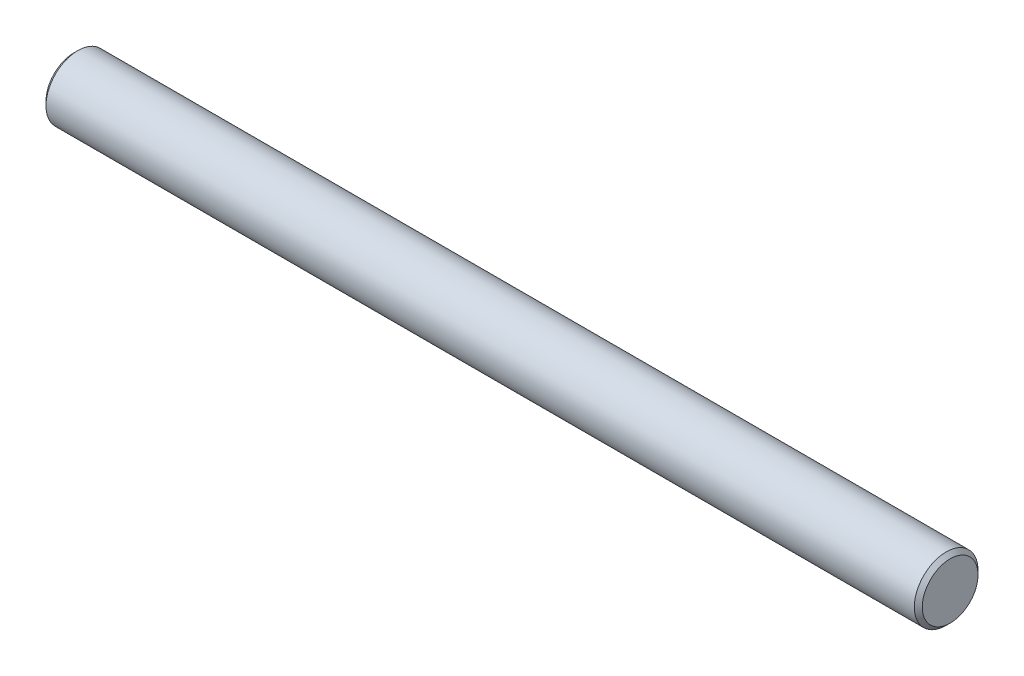
ISO-10303-21;
HEADER;
FILE_DESCRIPTION(('STEP AP214'),'2;1');
FILE_NAME('part.step','',(''),(''),'','','');
FILE_SCHEMA(('AUTOMOTIVE_DESIGN { 1 0 10303 214 1 1 1 1 }'));
ENDSEC;
DATA;
#1=APPLICATION_CONTEXT('core data for automotive mechanical design processes');
#2=APPLICATION_PROTOCOL_DEFINITION('international standard','automotive_design',2000,#1);
#3=PRODUCT_CONTEXT('',#1,'mechanical');
#4=PRODUCT('Part','Part','',(#3));
#5=PRODUCT_RELATED_PRODUCT_CATEGORY('part','',(#4));
#6=PRODUCT_DEFINITION_FORMATION('','',#4);
#7=PRODUCT_DEFINITION_CONTEXT('part definition',#1,'design');
#8=PRODUCT_DEFINITION('design','',#6,#7);
#9=PRODUCT_DEFINITION_SHAPE('','',#8);
#10=(LENGTH_UNIT() NAMED_UNIT(*) SI_UNIT(.MILLI.,.METRE.));
#11=(NAMED_UNIT(*) PLANE_ANGLE_UNIT() SI_UNIT($,.RADIAN.));
#12=(NAMED_UNIT(*) SI_UNIT($,.STERADIAN.) SOLID_ANGLE_UNIT());
#13=UNCERTAINTY_MEASURE_WITH_UNIT(LENGTH_MEASURE(1.E-05),#10,'distance_accuracy_value','');
#14=(GEOMETRIC_REPRESENTATION_CONTEXT(3) GLOBAL_UNCERTAINTY_ASSIGNED_CONTEXT((#13)) GLOBAL_UNIT_ASSIGNED_CONTEXT((#10,
#11,#12)) REPRESENTATION_CONTEXT('',''));
#15=CARTESIAN_POINT('',(0.,0.,0.));
#16=DIRECTION('',(0.,0.,1.));
#17=DIRECTION('',(1.,0.,0.));
#18=AXIS2_PLACEMENT_3D('',#15,#16,#17);
#19=CARTESIAN_POINT('',(0.,8.,0.));
#20=DIRECTION('',(-1.,0.,0.));
#21=DIRECTION('',(0.,-1.,0.));
#22=AXIS2_PLACEMENT_3D('',#19,#20,#21);
#23=PLANE('',#22);
#24=CARTESIAN_POINT('',(1.27415439310496E-12,0.,0.));
#25=DIRECTION('',(1.,0.,0.));
#26=DIRECTION('',(0.,0.,-1.));
#27=AXIS2_PLACEMENT_3D('',#24,#25,#26);
#28=CIRCLE('',#27,6.99999999999873);
#29=CARTESIAN_POINT('',(1.27415439310496E-12,0.,-6.99999999999873));
#30=VERTEX_POINT('',#29);
#31=EDGE_CURVE('E18',#30,#30,#28,.T.);
#32=ORIENTED_EDGE('',*,*,#31,.F.);
#33=EDGE_LOOP('',(#32));
#34=FACE_BOUND('',#33,.T.);
#35=ADVANCED_FACE('F15',(#34),#23,.T.);
#36=CARTESIAN_POINT('',(220.,0.,0.));
#37=DIRECTION('',(1.,0.,0.));
#38=DIRECTION('',(0.,1.,0.));
#39=AXIS2_PLACEMENT_3D('',#36,#37,#38);
#40=PLANE('',#39);
#41=CARTESIAN_POINT('',(219.999999999999,0.,0.));
#42=DIRECTION('',(-1.,0.,0.));
#43=DIRECTION('',(0.,0.,1.));
#44=AXIS2_PLACEMENT_3D('',#41,#42,#43);
#45=CIRCLE('',#44,6.99999999999884);
#46=CARTESIAN_POINT('',(219.999999999999,0.,6.99999999999884));
#47=VERTEX_POINT('',#46);
#48=EDGE_CURVE('E27',#47,#47,#45,.T.);
#49=ORIENTED_EDGE('',*,*,#48,.F.);
#50=EDGE_LOOP('',(#49));
#51=FACE_BOUND('',#50,.T.);
#52=ADVANCED_FACE('F42',(#51),#40,.T.);
#53=CARTESIAN_POINT('',(0.999999999998732,0.,0.));
#54=DIRECTION('',(1.,0.,0.));
#55=DIRECTION('',(0.,0.,-1.));
#56=AXIS2_PLACEMENT_3D('',#53,#54,#55);
#57=CONICAL_SURFACE('',#56,8.00000000000137,0.78539816340004);
#58=CARTESIAN_POINT('',(1.,0.,0.));
#59=DIRECTION('',(1.,0.,0.));
#60=DIRECTION('',(0.,1.,0.));
#61=AXIS2_PLACEMENT_3D('',#58,#59,#60);
#62=CIRCLE('',#61,8.00000000000009);
#63=CARTESIAN_POINT('',(1.,8.00000000000009,0.));
#64=VERTEX_POINT('',#63);
#65=EDGE_CURVE('E22',#64,#64,#62,.T.);
#66=ORIENTED_EDGE('',*,*,#65,.F.);
#67=EDGE_LOOP('',(#66));
#68=FACE_BOUND('',#67,.T.);
#69=ORIENTED_EDGE('',*,*,#31,.T.);
#70=EDGE_LOOP('',(#69));
#71=FACE_BOUND('',#70,.T.);
#72=ADVANCED_FACE('F39',(#68,#71),#57,.T.);
#73=CARTESIAN_POINT('',(219.000000000001,0.,0.));
#74=DIRECTION('',(-1.,0.,0.));
#75=DIRECTION('',(0.,0.,1.));
#76=AXIS2_PLACEMENT_3D('',#73,#74,#75);
#77=CONICAL_SURFACE('',#76,8.00000000000136,0.785398163399987);
#78=ORIENTED_EDGE('',*,*,#48,.T.);
#79=EDGE_LOOP('',(#78));
#80=FACE_BOUND('',#79,.T.);
#81=CARTESIAN_POINT('',(219.,0.,0.));
#82=DIRECTION('',(1.,0.,0.));
#83=DIRECTION('',(0.,1.,0.));
#84=AXIS2_PLACEMENT_3D('',#81,#82,#83);
#85=CIRCLE('',#84,8.00000000000009);
#86=CARTESIAN_POINT('',(219.,8.00000000000009,0.));
#87=VERTEX_POINT('',#86);
#88=EDGE_CURVE('E10',#87,#87,#85,.F.);
#89=ORIENTED_EDGE('',*,*,#88,.F.);
#90=EDGE_LOOP('',(#89));
#91=FACE_BOUND('',#90,.T.);
#92=ADVANCED_FACE('F50',(#80,#91),#77,.T.);
#93=CARTESIAN_POINT('',(195.,0.,0.));
#94=DIRECTION('',(1.,0.,0.));
#95=DIRECTION('',(0.,1.,0.));
#96=AXIS2_PLACEMENT_3D('',#93,#94,#95);
#97=CYLINDRICAL_SURFACE('',#96,8.00000000000009);
#98=ORIENTED_EDGE('',*,*,#88,.T.);
#99=EDGE_LOOP('',(#98));
#100=FACE_BOUND('',#99,.T.);
#101=ORIENTED_EDGE('',*,*,#65,.T.);
#102=EDGE_LOOP('',(#101));
#103=FACE_BOUND('',#102,.T.);
#104=ADVANCED_FACE('F48',(#100,#103),#97,.T.);
#105=CLOSED_SHELL('',(#35,#52,#72,#92,#104));
#106=MANIFOLD_SOLID_BREP('B1',#105);
#107=ADVANCED_BREP_SHAPE_REPRESENTATION('',(#18,#106),#14);
#108=SHAPE_DEFINITION_REPRESENTATION(#9,#107);
ENDSEC;
END-ISO-10303-21;
